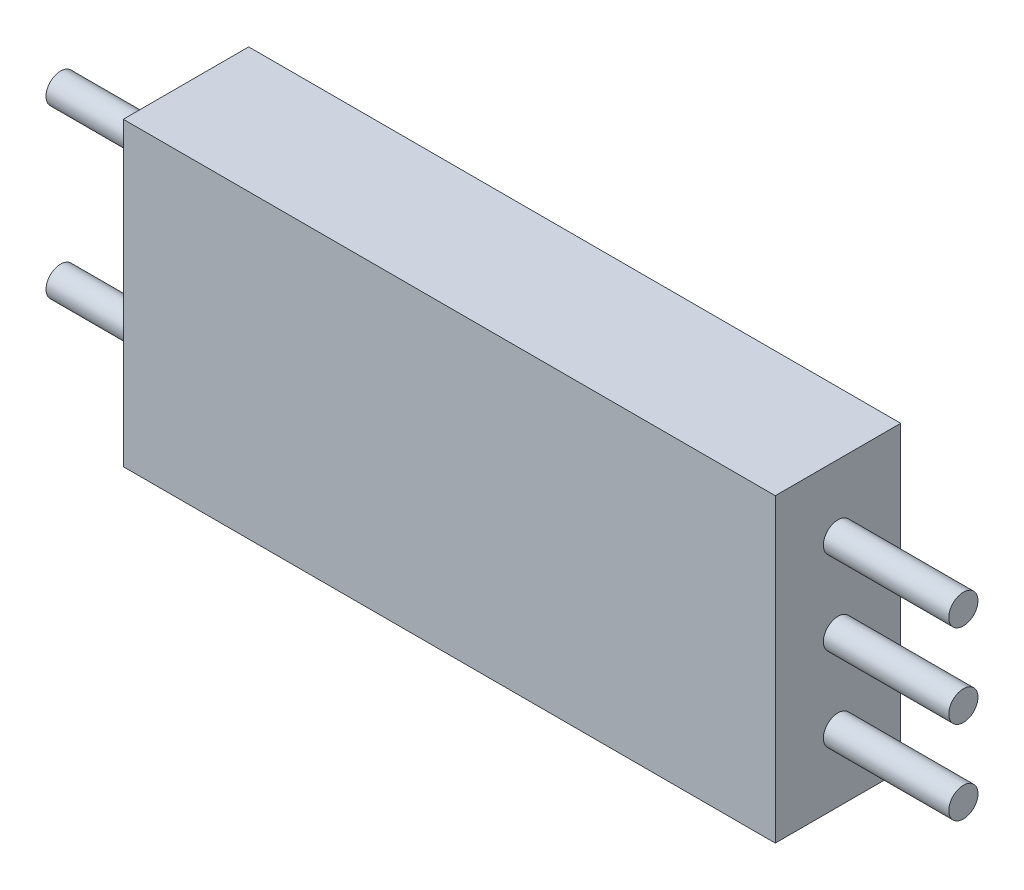
ISO-10303-21;
HEADER;
FILE_DESCRIPTION(('STEP AP214'),'2;1');
FILE_NAME('part.step','',(''),(''),'','','');
FILE_SCHEMA(('AUTOMOTIVE_DESIGN { 1 0 10303 214 1 1 1 1 }'));
ENDSEC;
DATA;
#1=APPLICATION_CONTEXT('core data for automotive mechanical design processes');
#2=APPLICATION_PROTOCOL_DEFINITION('international standard','automotive_design',2000,#1);
#3=PRODUCT_CONTEXT('',#1,'mechanical');
#4=PRODUCT('Part','Part','',(#3));
#5=PRODUCT_RELATED_PRODUCT_CATEGORY('part','',(#4));
#6=PRODUCT_DEFINITION_FORMATION('','',#4);
#7=PRODUCT_DEFINITION_CONTEXT('part definition',#1,'design');
#8=PRODUCT_DEFINITION('design','',#6,#7);
#9=PRODUCT_DEFINITION_SHAPE('','',#8);
#10=(LENGTH_UNIT() NAMED_UNIT(*) SI_UNIT(.MILLI.,.METRE.));
#11=(NAMED_UNIT(*) PLANE_ANGLE_UNIT() SI_UNIT($,.RADIAN.));
#12=(NAMED_UNIT(*) SI_UNIT($,.STERADIAN.) SOLID_ANGLE_UNIT());
#13=UNCERTAINTY_MEASURE_WITH_UNIT(LENGTH_MEASURE(1.E-05),#10,'distance_accuracy_value','');
#14=(GEOMETRIC_REPRESENTATION_CONTEXT(3) GLOBAL_UNCERTAINTY_ASSIGNED_CONTEXT((#13)) GLOBAL_UNIT_ASSIGNED_CONTEXT((#10,
#11,#12)) REPRESENTATION_CONTEXT('',''));
#15=CARTESIAN_POINT('',(0.,0.,0.));
#16=DIRECTION('',(0.,0.,1.));
#17=DIRECTION('',(1.,0.,0.));
#18=AXIS2_PLACEMENT_3D('',#15,#16,#17);
#19=CARTESIAN_POINT('',(39.,-18.,7.5));
#20=DIRECTION('',(-1.,0.,0.));
#21=DIRECTION('',(0.,0.,1.));
#22=AXIS2_PLACEMENT_3D('',#19,#20,#21);
#23=PLANE('',#22);
#24=CARTESIAN_POINT('',(39.,10.,0.));
#25=DIRECTION('',(-1.,0.,0.));
#26=DIRECTION('',(0.,0.,1.));
#27=AXIS2_PLACEMENT_3D('',#24,#25,#26);
#28=CIRCLE('',#27,1.75);
#29=CARTESIAN_POINT('',(39.,10.,1.75));
#30=VERTEX_POINT('',#29);
#31=EDGE_CURVE('E138',#30,#30,#28,.F.);
#32=ORIENTED_EDGE('',*,*,#31,.F.);
#33=EDGE_LOOP('',(#32));
#34=FACE_BOUND('',#33,.T.);
#35=CARTESIAN_POINT('',(39.,0.,0.));
#36=DIRECTION('',(-1.,0.,0.));
#37=DIRECTION('',(0.,0.,1.));
#38=AXIS2_PLACEMENT_3D('',#35,#36,#37);
#39=CIRCLE('',#38,1.75);
#40=CARTESIAN_POINT('',(39.,0.,1.75));
#41=VERTEX_POINT('',#40);
#42=EDGE_CURVE('E134',#41,#41,#39,.F.);
#43=ORIENTED_EDGE('',*,*,#42,.F.);
#44=EDGE_LOOP('',(#43));
#45=FACE_BOUND('',#44,.T.);
#46=CARTESIAN_POINT('',(39.,-9.99999999999999,0.));
#47=DIRECTION('',(-1.,0.,0.));
#48=DIRECTION('',(0.,0.,1.));
#49=AXIS2_PLACEMENT_3D('',#46,#47,#48);
#50=CIRCLE('',#49,1.75);
#51=CARTESIAN_POINT('',(39.,-9.99999999999999,1.75));
#52=VERTEX_POINT('',#51);
#53=EDGE_CURVE('E130',#52,#52,#50,.F.);
#54=ORIENTED_EDGE('',*,*,#53,.F.);
#55=EDGE_LOOP('',(#54));
#56=FACE_BOUND('',#55,.T.);
#57=DIRECTION('',(0.,1.,0.));
#58=VECTOR('',#57,1.);
#59=CARTESIAN_POINT('',(39.,-18.,-7.5));
#60=LINE('',#59,#58);
#61=CARTESIAN_POINT('',(39.,-18.,-7.5));
#62=VERTEX_POINT('',#61);
#63=CARTESIAN_POINT('',(39.,18.,-7.5));
#64=VERTEX_POINT('',#63);
#65=EDGE_CURVE('E113',#62,#64,#60,.T.);
#66=ORIENTED_EDGE('',*,*,#65,.T.);
#67=DIRECTION('',(0.,0.,-1.));
#68=VECTOR('',#67,1.);
#69=CARTESIAN_POINT('',(39.,18.,7.5));
#70=LINE('',#69,#68);
#71=CARTESIAN_POINT('',(39.,18.,7.5));
#72=VERTEX_POINT('',#71);
#73=EDGE_CURVE('E102',#72,#64,#70,.T.);
#74=ORIENTED_EDGE('',*,*,#73,.F.);
#75=DIRECTION('',(0.,1.,0.));
#76=VECTOR('',#75,1.);
#77=CARTESIAN_POINT('',(39.,-18.,7.5));
#78=LINE('',#77,#76);
#79=CARTESIAN_POINT('',(39.,-18.,7.5));
#80=VERTEX_POINT('',#79);
#81=EDGE_CURVE('E94',#80,#72,#78,.T.);
#82=ORIENTED_EDGE('',*,*,#81,.F.);
#83=DIRECTION('',(0.,0.,-1.));
#84=VECTOR('',#83,1.);
#85=CARTESIAN_POINT('',(39.,-18.,7.5));
#86=LINE('',#85,#84);
#87=EDGE_CURVE('E109',#80,#62,#86,.T.);
#88=ORIENTED_EDGE('',*,*,#87,.T.);
#89=EDGE_LOOP('',(#66,#74,#82,#88));
#90=FACE_BOUND('',#89,.T.);
#91=ADVANCED_FACE('F41',(#34,#45,#56,#90),#23,.F.);
#92=CARTESIAN_POINT('',(-39.,18.,7.5));
#93=DIRECTION('',(0.,-1.,0.));
#94=DIRECTION('',(0.,0.,-1.));
#95=AXIS2_PLACEMENT_3D('',#92,#93,#94);
#96=PLANE('',#95);
#97=DIRECTION('',(-1.,0.,0.));
#98=VECTOR('',#97,1.);
#99=CARTESIAN_POINT('',(-39.,18.,-7.5));
#100=LINE('',#99,#98);
#101=CARTESIAN_POINT('',(-39.,18.,-7.5));
#102=VERTEX_POINT('',#101);
#103=EDGE_CURVE('E100',#64,#102,#100,.T.);
#104=ORIENTED_EDGE('',*,*,#103,.T.);
#105=DIRECTION('',(0.,0.,-1.));
#106=VECTOR('',#105,1.);
#107=CARTESIAN_POINT('',(-39.,18.,7.5));
#108=LINE('',#107,#106);
#109=CARTESIAN_POINT('',(-39.,18.,7.5));
#110=VERTEX_POINT('',#109);
#111=EDGE_CURVE('E98',#110,#102,#108,.T.);
#112=ORIENTED_EDGE('',*,*,#111,.F.);
#113=DIRECTION('',(-1.,0.,0.));
#114=VECTOR('',#113,1.);
#115=CARTESIAN_POINT('',(-39.,18.,7.5));
#116=LINE('',#115,#114);
#117=EDGE_CURVE('E89',#72,#110,#116,.T.);
#118=ORIENTED_EDGE('',*,*,#117,.F.);
#119=ORIENTED_EDGE('',*,*,#73,.T.);
#120=EDGE_LOOP('',(#104,#112,#118,#119));
#121=FACE_BOUND('',#120,.T.);
#122=ADVANCED_FACE('F99',(#121),#96,.F.);
#123=CARTESIAN_POINT('',(-39.,-18.,7.5));
#124=DIRECTION('',(1.,0.,0.));
#125=DIRECTION('',(0.,0.,-1.));
#126=AXIS2_PLACEMENT_3D('',#123,#124,#125);
#127=PLANE('',#126);
#128=CARTESIAN_POINT('',(-39.,-10.,0.));
#129=DIRECTION('',(1.,0.,0.));
#130=DIRECTION('',(0.,0.,-1.));
#131=AXIS2_PLACEMENT_3D('',#128,#129,#130);
#132=CIRCLE('',#131,1.75);
#133=CARTESIAN_POINT('',(-39.,-10.,-1.75));
#134=VERTEX_POINT('',#133);
#135=EDGE_CURVE('E11',#134,#134,#132,.F.);
#136=ORIENTED_EDGE('',*,*,#135,.F.);
#137=EDGE_LOOP('',(#136));
#138=FACE_BOUND('',#137,.T.);
#139=CARTESIAN_POINT('',(-39.,10.,0.));
#140=DIRECTION('',(1.,0.,0.));
#141=DIRECTION('',(0.,0.,-1.));
#142=AXIS2_PLACEMENT_3D('',#139,#140,#141);
#143=CIRCLE('',#142,1.75);
#144=CARTESIAN_POINT('',(-39.,10.,-1.75));
#145=VERTEX_POINT('',#144);
#146=EDGE_CURVE('E50',#145,#145,#143,.F.);
#147=ORIENTED_EDGE('',*,*,#146,.F.);
#148=EDGE_LOOP('',(#147));
#149=FACE_BOUND('',#148,.T.);
#150=DIRECTION('',(0.,-1.,0.));
#151=VECTOR('',#150,1.);
#152=CARTESIAN_POINT('',(-39.,-18.,-7.5));
#153=LINE('',#152,#151);
#154=CARTESIAN_POINT('',(-39.,-18.,-7.5));
#155=VERTEX_POINT('',#154);
#156=EDGE_CURVE('E75',#102,#155,#153,.T.);
#157=ORIENTED_EDGE('',*,*,#156,.T.);
#158=DIRECTION('',(0.,0.,-1.));
#159=VECTOR('',#158,1.);
#160=CARTESIAN_POINT('',(-39.,-18.,7.5));
#161=LINE('',#160,#159);
#162=CARTESIAN_POINT('',(-39.,-18.,7.5));
#163=VERTEX_POINT('',#162);
#164=EDGE_CURVE('E103',#163,#155,#161,.T.);
#165=ORIENTED_EDGE('',*,*,#164,.F.);
#166=DIRECTION('',(0.,-1.,0.));
#167=VECTOR('',#166,1.);
#168=CARTESIAN_POINT('',(-39.,-18.,7.5));
#169=LINE('',#168,#167);
#170=EDGE_CURVE('E92',#110,#163,#169,.T.);
#171=ORIENTED_EDGE('',*,*,#170,.F.);
#172=ORIENTED_EDGE('',*,*,#111,.T.);
#173=EDGE_LOOP('',(#157,#165,#171,#172));
#174=FACE_BOUND('',#173,.T.);
#175=ADVANCED_FACE('F105',(#138,#149,#174),#127,.F.);
#176=CARTESIAN_POINT('',(-39.,-18.,7.5));
#177=DIRECTION('',(0.,1.,0.));
#178=DIRECTION('',(0.,0.,1.));
#179=AXIS2_PLACEMENT_3D('',#176,#177,#178);
#180=PLANE('',#179);
#181=DIRECTION('',(1.,0.,0.));
#182=VECTOR('',#181,1.);
#183=CARTESIAN_POINT('',(-39.,-18.,-7.5));
#184=LINE('',#183,#182);
#185=EDGE_CURVE('E81',#155,#62,#184,.T.);
#186=ORIENTED_EDGE('',*,*,#185,.T.);
#187=ORIENTED_EDGE('',*,*,#87,.F.);
#188=DIRECTION('',(1.,0.,0.));
#189=VECTOR('',#188,1.);
#190=CARTESIAN_POINT('',(-39.,-18.,7.5));
#191=LINE('',#190,#189);
#192=EDGE_CURVE('E58',#163,#80,#191,.T.);
#193=ORIENTED_EDGE('',*,*,#192,.F.);
#194=ORIENTED_EDGE('',*,*,#164,.T.);
#195=EDGE_LOOP('',(#186,#187,#193,#194));
#196=FACE_BOUND('',#195,.T.);
#197=ADVANCED_FACE('F148',(#196),#180,.F.);
#198=CARTESIAN_POINT('',(0.,0.,7.5));
#199=DIRECTION('',(0.,0.,-1.));
#200=DIRECTION('',(-1.,0.,0.));
#201=AXIS2_PLACEMENT_3D('',#198,#199,#200);
#202=PLANE('',#201);
#203=ORIENTED_EDGE('',*,*,#81,.T.);
#204=ORIENTED_EDGE('',*,*,#117,.T.);
#205=ORIENTED_EDGE('',*,*,#170,.T.);
#206=ORIENTED_EDGE('',*,*,#192,.T.);
#207=EDGE_LOOP('',(#203,#204,#205,#206));
#208=FACE_BOUND('',#207,.T.);
#209=ADVANCED_FACE('F90',(#208),#202,.F.);
#210=CARTESIAN_POINT('',(0.,0.,-7.5));
#211=DIRECTION('',(0.,0.,-1.));
#212=DIRECTION('',(-1.,0.,0.));
#213=AXIS2_PLACEMENT_3D('',#210,#211,#212);
#214=PLANE('',#213);
#215=ORIENTED_EDGE('',*,*,#65,.F.);
#216=ORIENTED_EDGE('',*,*,#185,.F.);
#217=ORIENTED_EDGE('',*,*,#156,.F.);
#218=ORIENTED_EDGE('',*,*,#103,.F.);
#219=EDGE_LOOP('',(#215,#216,#217,#218));
#220=FACE_BOUND('',#219,.T.);
#221=ADVANCED_FACE('F173',(#220),#214,.T.);
#222=CARTESIAN_POINT('',(54.,-9.99999999999999,0.));
#223=DIRECTION('',(-1.,0.,0.));
#224=DIRECTION('',(0.,0.,1.));
#225=AXIS2_PLACEMENT_3D('',#222,#223,#224);
#226=CYLINDRICAL_SURFACE('',#225,1.75);
#227=CARTESIAN_POINT('',(54.,-9.99999999999999,0.));
#228=DIRECTION('',(1.,0.,0.));
#229=DIRECTION('',(0.,0.,-1.));
#230=AXIS2_PLACEMENT_3D('',#227,#228,#229);
#231=CIRCLE('',#230,1.75);
#232=CARTESIAN_POINT('',(54.,-9.99999999999999,-1.75));
#233=VERTEX_POINT('',#232);
#234=EDGE_CURVE('E117',#233,#233,#231,.T.);
#235=ORIENTED_EDGE('',*,*,#234,.F.);
#236=EDGE_LOOP('',(#235));
#237=FACE_BOUND('',#236,.T.);
#238=ORIENTED_EDGE('',*,*,#53,.T.);
#239=EDGE_LOOP('',(#238));
#240=FACE_BOUND('',#239,.T.);
#241=ADVANCED_FACE('F175',(#237,#240),#226,.T.);
#242=CARTESIAN_POINT('',(54.,-9.99999999999999,0.));
#243=DIRECTION('',(1.,0.,0.));
#244=DIRECTION('',(0.,0.,-1.));
#245=AXIS2_PLACEMENT_3D('',#242,#243,#244);
#246=PLANE('',#245);
#247=ORIENTED_EDGE('',*,*,#234,.T.);
#248=EDGE_LOOP('',(#247));
#249=FACE_BOUND('',#248,.T.);
#250=ADVANCED_FACE('F180',(#249),#246,.T.);
#251=CARTESIAN_POINT('',(54.,0.,0.));
#252=DIRECTION('',(-1.,0.,0.));
#253=DIRECTION('',(0.,0.,1.));
#254=AXIS2_PLACEMENT_3D('',#251,#252,#253);
#255=CYLINDRICAL_SURFACE('',#254,1.75);
#256=CARTESIAN_POINT('',(54.,0.,0.));
#257=DIRECTION('',(1.,0.,0.));
#258=DIRECTION('',(0.,0.,-1.));
#259=AXIS2_PLACEMENT_3D('',#256,#257,#258);
#260=CIRCLE('',#259,1.75);
#261=CARTESIAN_POINT('',(54.,0.,-1.75));
#262=VERTEX_POINT('',#261);
#263=EDGE_CURVE('E234',#262,#262,#260,.T.);
#264=ORIENTED_EDGE('',*,*,#263,.F.);
#265=EDGE_LOOP('',(#264));
#266=FACE_BOUND('',#265,.T.);
#267=ORIENTED_EDGE('',*,*,#42,.T.);
#268=EDGE_LOOP('',(#267));
#269=FACE_BOUND('',#268,.T.);
#270=ADVANCED_FACE('F187',(#266,#269),#255,.T.);
#271=CARTESIAN_POINT('',(54.,0.,0.));
#272=DIRECTION('',(1.,0.,0.));
#273=DIRECTION('',(0.,0.,-1.));
#274=AXIS2_PLACEMENT_3D('',#271,#272,#273);
#275=PLANE('',#274);
#276=ORIENTED_EDGE('',*,*,#263,.T.);
#277=EDGE_LOOP('',(#276));
#278=FACE_BOUND('',#277,.T.);
#279=ADVANCED_FACE('F191',(#278),#275,.T.);
#280=CARTESIAN_POINT('',(54.,10.,0.));
#281=DIRECTION('',(-1.,0.,0.));
#282=DIRECTION('',(0.,0.,1.));
#283=AXIS2_PLACEMENT_3D('',#280,#281,#282);
#284=CYLINDRICAL_SURFACE('',#283,1.75);
#285=CARTESIAN_POINT('',(54.,10.,0.));
#286=DIRECTION('',(1.,0.,0.));
#287=DIRECTION('',(0.,0.,-1.));
#288=AXIS2_PLACEMENT_3D('',#285,#286,#287);
#289=CIRCLE('',#288,1.75);
#290=CARTESIAN_POINT('',(54.,10.,-1.75));
#291=VERTEX_POINT('',#290);
#292=EDGE_CURVE('E228',#291,#291,#289,.T.);
#293=ORIENTED_EDGE('',*,*,#292,.F.);
#294=EDGE_LOOP('',(#293));
#295=FACE_BOUND('',#294,.T.);
#296=ORIENTED_EDGE('',*,*,#31,.T.);
#297=EDGE_LOOP('',(#296));
#298=FACE_BOUND('',#297,.T.);
#299=ADVANCED_FACE('F195',(#295,#298),#284,.T.);
#300=CARTESIAN_POINT('',(54.,10.,0.));
#301=DIRECTION('',(1.,0.,0.));
#302=DIRECTION('',(0.,0.,-1.));
#303=AXIS2_PLACEMENT_3D('',#300,#301,#302);
#304=PLANE('',#303);
#305=ORIENTED_EDGE('',*,*,#292,.T.);
#306=EDGE_LOOP('',(#305));
#307=FACE_BOUND('',#306,.T.);
#308=ADVANCED_FACE('F199',(#307),#304,.T.);
#309=CARTESIAN_POINT('',(-54.,10.,0.));
#310=DIRECTION('',(1.,0.,0.));
#311=DIRECTION('',(0.,0.,-1.));
#312=AXIS2_PLACEMENT_3D('',#309,#310,#311);
#313=CYLINDRICAL_SURFACE('',#312,1.75);
#314=CARTESIAN_POINT('',(-54.,10.,0.));
#315=DIRECTION('',(-1.,0.,0.));
#316=DIRECTION('',(0.,0.,1.));
#317=AXIS2_PLACEMENT_3D('',#314,#315,#316);
#318=CIRCLE('',#317,1.75);
#319=CARTESIAN_POINT('',(-54.,10.,1.75));
#320=VERTEX_POINT('',#319);
#321=EDGE_CURVE('E224',#320,#320,#318,.T.);
#322=ORIENTED_EDGE('',*,*,#321,.F.);
#323=EDGE_LOOP('',(#322));
#324=FACE_BOUND('',#323,.T.);
#325=ORIENTED_EDGE('',*,*,#146,.T.);
#326=EDGE_LOOP('',(#325));
#327=FACE_BOUND('',#326,.T.);
#328=ADVANCED_FACE('F145',(#324,#327),#313,.T.);
#329=CARTESIAN_POINT('',(-54.,10.,0.));
#330=DIRECTION('',(-1.,0.,0.));
#331=DIRECTION('',(0.,0.,1.));
#332=AXIS2_PLACEMENT_3D('',#329,#330,#331);
#333=PLANE('',#332);
#334=ORIENTED_EDGE('',*,*,#321,.T.);
#335=EDGE_LOOP('',(#334));
#336=FACE_BOUND('',#335,.T.);
#337=ADVANCED_FACE('F206',(#336),#333,.T.);
#338=CARTESIAN_POINT('',(-54.,-10.,0.));
#339=DIRECTION('',(1.,0.,0.));
#340=DIRECTION('',(0.,0.,-1.));
#341=AXIS2_PLACEMENT_3D('',#338,#339,#340);
#342=CYLINDRICAL_SURFACE('',#341,1.75);
#343=CARTESIAN_POINT('',(-54.,-10.,0.));
#344=DIRECTION('',(-1.,0.,0.));
#345=DIRECTION('',(0.,0.,1.));
#346=AXIS2_PLACEMENT_3D('',#343,#344,#345);
#347=CIRCLE('',#346,1.75);
#348=CARTESIAN_POINT('',(-54.,-10.,1.75));
#349=VERTEX_POINT('',#348);
#350=EDGE_CURVE('E222',#349,#349,#347,.T.);
#351=ORIENTED_EDGE('',*,*,#350,.F.);
#352=EDGE_LOOP('',(#351));
#353=FACE_BOUND('',#352,.T.);
#354=ORIENTED_EDGE('',*,*,#135,.T.);
#355=EDGE_LOOP('',(#354));
#356=FACE_BOUND('',#355,.T.);
#357=ADVANCED_FACE('F210',(#353,#356),#342,.T.);
#358=CARTESIAN_POINT('',(-54.,-10.,0.));
#359=DIRECTION('',(-1.,0.,0.));
#360=DIRECTION('',(0.,0.,1.));
#361=AXIS2_PLACEMENT_3D('',#358,#359,#360);
#362=PLANE('',#361);
#363=ORIENTED_EDGE('',*,*,#350,.T.);
#364=EDGE_LOOP('',(#363));
#365=FACE_BOUND('',#364,.T.);
#366=ADVANCED_FACE('F214',(#365),#362,.T.);
#367=CLOSED_SHELL('',(#91,#122,#175,#197,#209,#221,#241,#250,#270,#279,#299,#308,#328,#337,#357,#366));
#368=MANIFOLD_SOLID_BREP('B2',#367);
#369=ADVANCED_BREP_SHAPE_REPRESENTATION('',(#18,#368),#14);
#370=SHAPE_DEFINITION_REPRESENTATION(#9,#369);
ENDSEC;
END-ISO-10303-21;
